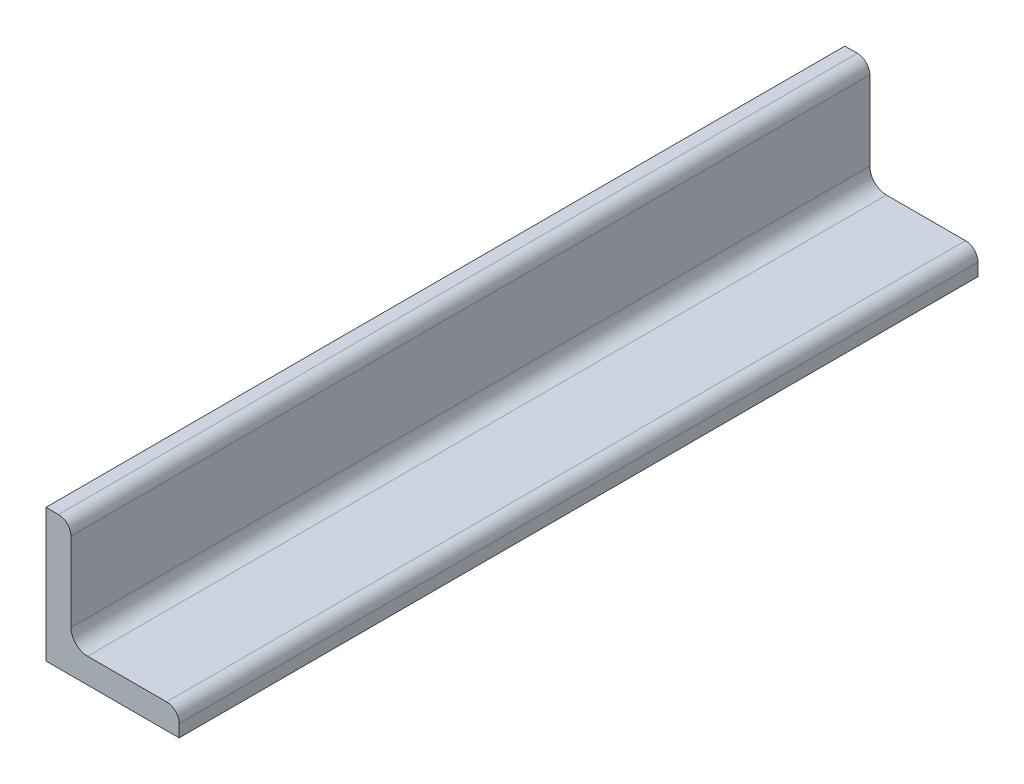
ISO-10303-21;
HEADER;
FILE_DESCRIPTION(('STEP AP214'),'2;1');
FILE_NAME('part.step','',(''),(''),'','','');
FILE_SCHEMA(('AUTOMOTIVE_DESIGN { 1 0 10303 214 1 1 1 1 }'));
ENDSEC;
DATA;
#1=APPLICATION_CONTEXT('core data for automotive mechanical design processes');
#2=APPLICATION_PROTOCOL_DEFINITION('international standard','automotive_design',2000,#1);
#3=PRODUCT_CONTEXT('',#1,'mechanical');
#4=PRODUCT('Part','Part','',(#3));
#5=PRODUCT_RELATED_PRODUCT_CATEGORY('part','',(#4));
#6=PRODUCT_DEFINITION_FORMATION('','',#4);
#7=PRODUCT_DEFINITION_CONTEXT('part definition',#1,'design');
#8=PRODUCT_DEFINITION('design','',#6,#7);
#9=PRODUCT_DEFINITION_SHAPE('','',#8);
#10=(LENGTH_UNIT() NAMED_UNIT(*) SI_UNIT(.MILLI.,.METRE.));
#11=(NAMED_UNIT(*) PLANE_ANGLE_UNIT() SI_UNIT($,.RADIAN.));
#12=(NAMED_UNIT(*) SI_UNIT($,.STERADIAN.) SOLID_ANGLE_UNIT());
#13=UNCERTAINTY_MEASURE_WITH_UNIT(LENGTH_MEASURE(1.E-05),#10,'distance_accuracy_value','');
#14=(GEOMETRIC_REPRESENTATION_CONTEXT(3) GLOBAL_UNCERTAINTY_ASSIGNED_CONTEXT((#13)) GLOBAL_UNIT_ASSIGNED_CONTEXT((#10,
#11,#12)) REPRESENTATION_CONTEXT('',''));
#15=CARTESIAN_POINT('',(0.,0.,0.));
#16=DIRECTION('',(0.,0.,1.));
#17=DIRECTION('',(1.,0.,0.));
#18=AXIS2_PLACEMENT_3D('',#15,#16,#17);
#19=CARTESIAN_POINT('',(0.116507760447575,51.418609434565,304.8));
#20=DIRECTION('',(1.,0.,0.));
#21=DIRECTION('',(0.,0.,-1.));
#22=AXIS2_PLACEMENT_3D('',#19,#20,#21);
#23=PLANE('',#22);
#24=DIRECTION('',(0.,-1.,0.));
#25=VECTOR('',#24,1.);
#26=CARTESIAN_POINT('',(0.116507760447575,51.418609434565,0.));
#27=LINE('',#26,#25);
#28=CARTESIAN_POINT('',(0.116507760447575,51.418609434565,0.));
#29=VERTEX_POINT('',#28);
#30=CARTESIAN_POINT('',(0.116507760447575,0.618609434565042,0.));
#31=VERTEX_POINT('',#30);
#32=EDGE_CURVE('E135',#29,#31,#27,.T.);
#33=ORIENTED_EDGE('',*,*,#32,.T.);
#34=DIRECTION('',(0.,0.,-1.));
#35=VECTOR('',#34,1.);
#36=CARTESIAN_POINT('',(0.116507760447575,0.618609434565042,304.8));
#37=LINE('',#36,#35);
#38=CARTESIAN_POINT('',(0.116507760447575,0.618609434565042,304.8));
#39=VERTEX_POINT('',#38);
#40=EDGE_CURVE('E11',#39,#31,#37,.T.);
#41=ORIENTED_EDGE('',*,*,#40,.F.);
#42=DIRECTION('',(0.,-1.,0.));
#43=VECTOR('',#42,1.);
#44=CARTESIAN_POINT('',(0.116507760447575,51.418609434565,304.8));
#45=LINE('',#44,#43);
#46=CARTESIAN_POINT('',(0.116507760447575,51.418609434565,304.8));
#47=VERTEX_POINT('',#46);
#48=EDGE_CURVE('E151',#47,#39,#45,.T.);
#49=ORIENTED_EDGE('',*,*,#48,.F.);
#50=DIRECTION('',(0.,0.,-1.));
#51=VECTOR('',#50,1.);
#52=CARTESIAN_POINT('',(0.116507760447575,51.418609434565,304.8));
#53=LINE('',#52,#51);
#54=EDGE_CURVE('E131',#47,#29,#53,.T.);
#55=ORIENTED_EDGE('',*,*,#54,.T.);
#56=EDGE_LOOP('',(#33,#41,#49,#55));
#57=FACE_BOUND('',#56,.T.);
#58=ADVANCED_FACE('F33',(#57),#23,.F.);
#59=CARTESIAN_POINT('',(0.116507760447575,0.618609434565042,304.8));
#60=DIRECTION('',(0.,1.,0.));
#61=DIRECTION('',(0.,0.,1.));
#62=AXIS2_PLACEMENT_3D('',#59,#60,#61);
#63=PLANE('',#62);
#64=DIRECTION('',(1.,0.,0.));
#65=VECTOR('',#64,1.);
#66=CARTESIAN_POINT('',(0.116507760447575,0.618609434565042,0.));
#67=LINE('',#66,#65);
#68=CARTESIAN_POINT('',(50.9165077604476,0.618609434565042,0.));
#69=VERTEX_POINT('',#68);
#70=EDGE_CURVE('E138',#31,#69,#67,.T.);
#71=ORIENTED_EDGE('',*,*,#70,.T.);
#72=DIRECTION('',(0.,0.,-1.));
#73=VECTOR('',#72,1.);
#74=CARTESIAN_POINT('',(50.9165077604476,0.618609434565042,304.8));
#75=LINE('',#74,#73);
#76=CARTESIAN_POINT('',(50.9165077604476,0.618609434565042,304.8));
#77=VERTEX_POINT('',#76);
#78=EDGE_CURVE('E41',#77,#69,#75,.T.);
#79=ORIENTED_EDGE('',*,*,#78,.F.);
#80=DIRECTION('',(1.,0.,0.));
#81=VECTOR('',#80,1.);
#82=CARTESIAN_POINT('',(0.116507760447575,0.618609434565042,304.8));
#83=LINE('',#82,#81);
#84=EDGE_CURVE('E95',#39,#77,#83,.T.);
#85=ORIENTED_EDGE('',*,*,#84,.F.);
#86=ORIENTED_EDGE('',*,*,#40,.T.);
#87=EDGE_LOOP('',(#71,#79,#85,#86));
#88=FACE_BOUND('',#87,.T.);
#89=ADVANCED_FACE('F194',(#88),#63,.F.);
#90=CARTESIAN_POINT('',(50.9165077604476,0.618609434565042,304.8));
#91=DIRECTION('',(-1.,0.,0.));
#92=DIRECTION('',(0.,0.,1.));
#93=AXIS2_PLACEMENT_3D('',#90,#91,#92);
#94=PLANE('',#93);
#95=DIRECTION('',(0.,1.,0.));
#96=VECTOR('',#95,1.);
#97=CARTESIAN_POINT('',(50.9165077604476,0.618609434565042,0.));
#98=LINE('',#97,#96);
#99=CARTESIAN_POINT('',(50.9165077604476,5.38110943456504,0.));
#100=VERTEX_POINT('',#99);
#101=EDGE_CURVE('E140',#69,#100,#98,.T.);
#102=ORIENTED_EDGE('',*,*,#101,.T.);
#103=DIRECTION('',(0.,0.,-1.));
#104=VECTOR('',#103,1.);
#105=CARTESIAN_POINT('',(50.9165077604476,5.38110943456504,304.8));
#106=LINE('',#105,#104);
#107=CARTESIAN_POINT('',(50.9165077604476,5.38110943456504,304.8));
#108=VERTEX_POINT('',#107);
#109=EDGE_CURVE('E161',#108,#100,#106,.T.);
#110=ORIENTED_EDGE('',*,*,#109,.F.);
#111=DIRECTION('',(0.,1.,0.));
#112=VECTOR('',#111,1.);
#113=CARTESIAN_POINT('',(50.9165077604476,0.618609434565042,304.8));
#114=LINE('',#113,#112);
#115=EDGE_CURVE('E169',#77,#108,#114,.T.);
#116=ORIENTED_EDGE('',*,*,#115,.F.);
#117=ORIENTED_EDGE('',*,*,#78,.T.);
#118=EDGE_LOOP('',(#102,#110,#116,#117));
#119=FACE_BOUND('',#118,.T.);
#120=ADVANCED_FACE('F167',(#119),#94,.F.);
#121=CARTESIAN_POINT('',(46.1540077604476,5.38110943456504,304.8));
#122=DIRECTION('',(0.,0.,-1.));
#123=DIRECTION('',(-1.,0.,0.));
#124=AXIS2_PLACEMENT_3D('',#121,#122,#123);
#125=CYLINDRICAL_SURFACE('',#124,4.7625);
#126=CARTESIAN_POINT('',(46.1540077604476,5.38110943456504,0.));
#127=DIRECTION('',(0.,0.,1.));
#128=DIRECTION('',(1.,0.,0.));
#129=AXIS2_PLACEMENT_3D('',#126,#127,#128);
#130=CIRCLE('',#129,4.7625);
#131=CARTESIAN_POINT('',(46.1540077604476,10.143609434565,0.));
#132=VERTEX_POINT('',#131);
#133=EDGE_CURVE('E142',#100,#132,#130,.T.);
#134=ORIENTED_EDGE('',*,*,#133,.T.);
#135=DIRECTION('',(0.,0.,-1.));
#136=VECTOR('',#135,1.);
#137=CARTESIAN_POINT('',(46.1540077604476,10.143609434565,304.8));
#138=LINE('',#137,#136);
#139=CARTESIAN_POINT('',(46.1540077604476,10.143609434565,304.8));
#140=VERTEX_POINT('',#139);
#141=EDGE_CURVE('E158',#140,#132,#138,.T.);
#142=ORIENTED_EDGE('',*,*,#141,.F.);
#143=CARTESIAN_POINT('',(46.1540077604476,5.38110943456504,304.8));
#144=DIRECTION('',(0.,0.,1.));
#145=DIRECTION('',(1.,0.,0.));
#146=AXIS2_PLACEMENT_3D('',#143,#144,#145);
#147=CIRCLE('',#146,4.7625);
#148=EDGE_CURVE('E185',#108,#140,#147,.T.);
#149=ORIENTED_EDGE('',*,*,#148,.F.);
#150=ORIENTED_EDGE('',*,*,#109,.T.);
#151=EDGE_LOOP('',(#134,#142,#149,#150));
#152=FACE_BOUND('',#151,.T.);
#153=ADVANCED_FACE('F178',(#152),#125,.T.);
#154=CARTESIAN_POINT('',(46.1540077604476,10.143609434565,304.8));
#155=DIRECTION('',(0.,-1.,0.));
#156=DIRECTION('',(0.,0.,-1.));
#157=AXIS2_PLACEMENT_3D('',#154,#155,#156);
#158=PLANE('',#157);
#159=DIRECTION('',(-1.,0.,0.));
#160=VECTOR('',#159,1.);
#161=CARTESIAN_POINT('',(46.1540077604476,10.143609434565,0.));
#162=LINE('',#161,#160);
#163=CARTESIAN_POINT('',(15.9915077604476,10.143609434565,0.));
#164=VERTEX_POINT('',#163);
#165=EDGE_CURVE('E144',#132,#164,#162,.T.);
#166=ORIENTED_EDGE('',*,*,#165,.T.);
#167=DIRECTION('',(0.,0.,-1.));
#168=VECTOR('',#167,1.);
#169=CARTESIAN_POINT('',(15.9915077604476,10.143609434565,304.8));
#170=LINE('',#169,#168);
#171=CARTESIAN_POINT('',(15.9915077604476,10.143609434565,304.8));
#172=VERTEX_POINT('',#171);
#173=EDGE_CURVE('E155',#172,#164,#170,.T.);
#174=ORIENTED_EDGE('',*,*,#173,.F.);
#175=DIRECTION('',(-1.,0.,0.));
#176=VECTOR('',#175,1.);
#177=CARTESIAN_POINT('',(46.1540077604476,10.143609434565,304.8));
#178=LINE('',#177,#176);
#179=EDGE_CURVE('E184',#140,#172,#178,.T.);
#180=ORIENTED_EDGE('',*,*,#179,.F.);
#181=ORIENTED_EDGE('',*,*,#141,.T.);
#182=EDGE_LOOP('',(#166,#174,#180,#181));
#183=FACE_BOUND('',#182,.T.);
#184=ADVANCED_FACE('F182',(#183),#158,.F.);
#185=CARTESIAN_POINT('',(15.9915077604476,16.493609434565,304.8));
#186=DIRECTION('',(0.,0.,-1.));
#187=DIRECTION('',(-1.,0.,0.));
#188=AXIS2_PLACEMENT_3D('',#185,#186,#187);
#189=CYLINDRICAL_SURFACE('',#188,6.34999999999999);
#190=CARTESIAN_POINT('',(15.9915077604476,16.493609434565,0.));
#191=DIRECTION('',(0.,0.,-1.));
#192=DIRECTION('',(1.,0.,0.));
#193=AXIS2_PLACEMENT_3D('',#190,#191,#192);
#194=CIRCLE('',#193,6.34999999999999);
#195=CARTESIAN_POINT('',(9.64150776044758,16.493609434565,0.));
#196=VERTEX_POINT('',#195);
#197=EDGE_CURVE('E146',#164,#196,#194,.T.);
#198=ORIENTED_EDGE('',*,*,#197,.T.);
#199=DIRECTION('',(0.,0.,-1.));
#200=VECTOR('',#199,1.);
#201=CARTESIAN_POINT('',(9.64150776044758,16.493609434565,304.8));
#202=LINE('',#201,#200);
#203=CARTESIAN_POINT('',(9.64150776044758,16.493609434565,304.8));
#204=VERTEX_POINT('',#203);
#205=EDGE_CURVE('E126',#204,#196,#202,.T.);
#206=ORIENTED_EDGE('',*,*,#205,.F.);
#207=CARTESIAN_POINT('',(15.9915077604476,16.493609434565,304.8));
#208=DIRECTION('',(0.,0.,-1.));
#209=DIRECTION('',(1.,0.,0.));
#210=AXIS2_PLACEMENT_3D('',#207,#208,#209);
#211=CIRCLE('',#210,6.34999999999999);
#212=EDGE_CURVE('E117',#172,#204,#211,.T.);
#213=ORIENTED_EDGE('',*,*,#212,.F.);
#214=ORIENTED_EDGE('',*,*,#173,.T.);
#215=EDGE_LOOP('',(#198,#206,#213,#214));
#216=FACE_BOUND('',#215,.T.);
#217=ADVANCED_FACE('F206',(#216),#189,.F.);
#218=CARTESIAN_POINT('',(9.64150776044758,16.493609434565,304.8));
#219=DIRECTION('',(-1.,0.,0.));
#220=DIRECTION('',(0.,0.,1.));
#221=AXIS2_PLACEMENT_3D('',#218,#219,#220);
#222=PLANE('',#221);
#223=DIRECTION('',(0.,1.,0.));
#224=VECTOR('',#223,1.);
#225=CARTESIAN_POINT('',(9.64150776044758,16.493609434565,0.));
#226=LINE('',#225,#224);
#227=CARTESIAN_POINT('',(9.64150776044758,46.656109434565,0.));
#228=VERTEX_POINT('',#227);
#229=EDGE_CURVE('E125',#196,#228,#226,.T.);
#230=ORIENTED_EDGE('',*,*,#229,.T.);
#231=DIRECTION('',(0.,0.,-1.));
#232=VECTOR('',#231,1.);
#233=CARTESIAN_POINT('',(9.64150776044758,46.656109434565,304.8));
#234=LINE('',#233,#232);
#235=CARTESIAN_POINT('',(9.64150776044758,46.656109434565,304.8));
#236=VERTEX_POINT('',#235);
#237=EDGE_CURVE('E122',#236,#228,#234,.T.);
#238=ORIENTED_EDGE('',*,*,#237,.F.);
#239=DIRECTION('',(0.,1.,0.));
#240=VECTOR('',#239,1.);
#241=CARTESIAN_POINT('',(9.64150776044758,16.493609434565,304.8));
#242=LINE('',#241,#240);
#243=EDGE_CURVE('E111',#204,#236,#242,.T.);
#244=ORIENTED_EDGE('',*,*,#243,.F.);
#245=ORIENTED_EDGE('',*,*,#205,.T.);
#246=EDGE_LOOP('',(#230,#238,#244,#245));
#247=FACE_BOUND('',#246,.T.);
#248=ADVANCED_FACE('F123',(#247),#222,.F.);
#249=CARTESIAN_POINT('',(4.87900776044757,46.656109434565,304.8));
#250=DIRECTION('',(0.,0.,-1.));
#251=DIRECTION('',(-1.,0.,0.));
#252=AXIS2_PLACEMENT_3D('',#249,#250,#251);
#253=CYLINDRICAL_SURFACE('',#252,4.7625);
#254=CARTESIAN_POINT('',(4.87900776044757,46.656109434565,0.));
#255=DIRECTION('',(0.,0.,1.));
#256=DIRECTION('',(1.,0.,0.));
#257=AXIS2_PLACEMENT_3D('',#254,#255,#256);
#258=CIRCLE('',#257,4.7625);
#259=CARTESIAN_POINT('',(4.87900776044758,51.418609434565,0.));
#260=VERTEX_POINT('',#259);
#261=EDGE_CURVE('E81',#228,#260,#258,.T.);
#262=ORIENTED_EDGE('',*,*,#261,.T.);
#263=DIRECTION('',(0.,0.,-1.));
#264=VECTOR('',#263,1.);
#265=CARTESIAN_POINT('',(4.87900776044758,51.418609434565,304.8));
#266=LINE('',#265,#264);
#267=CARTESIAN_POINT('',(4.87900776044758,51.418609434565,304.8));
#268=VERTEX_POINT('',#267);
#269=EDGE_CURVE('E127',#268,#260,#266,.T.);
#270=ORIENTED_EDGE('',*,*,#269,.F.);
#271=CARTESIAN_POINT('',(4.87900776044757,46.656109434565,304.8));
#272=DIRECTION('',(0.,0.,1.));
#273=DIRECTION('',(1.,0.,0.));
#274=AXIS2_PLACEMENT_3D('',#271,#272,#273);
#275=CIRCLE('',#274,4.7625);
#276=EDGE_CURVE('E115',#236,#268,#275,.T.);
#277=ORIENTED_EDGE('',*,*,#276,.F.);
#278=ORIENTED_EDGE('',*,*,#237,.T.);
#279=EDGE_LOOP('',(#262,#270,#277,#278));
#280=FACE_BOUND('',#279,.T.);
#281=ADVANCED_FACE('F129',(#280),#253,.T.);
#282=CARTESIAN_POINT('',(4.87900776044758,51.418609434565,304.8));
#283=DIRECTION('',(0.,-1.,0.));
#284=DIRECTION('',(0.,0.,-1.));
#285=AXIS2_PLACEMENT_3D('',#282,#283,#284);
#286=PLANE('',#285);
#287=DIRECTION('',(-1.,0.,0.));
#288=VECTOR('',#287,1.);
#289=CARTESIAN_POINT('',(4.87900776044758,51.418609434565,0.));
#290=LINE('',#289,#288);
#291=EDGE_CURVE('E87',#260,#29,#290,.T.);
#292=ORIENTED_EDGE('',*,*,#291,.T.);
#293=ORIENTED_EDGE('',*,*,#54,.F.);
#294=DIRECTION('',(-1.,0.,0.));
#295=VECTOR('',#294,1.);
#296=CARTESIAN_POINT('',(4.87900776044758,51.418609434565,304.8));
#297=LINE('',#296,#295);
#298=EDGE_CURVE('E49',#268,#47,#297,.T.);
#299=ORIENTED_EDGE('',*,*,#298,.F.);
#300=ORIENTED_EDGE('',*,*,#269,.T.);
#301=EDGE_LOOP('',(#292,#293,#299,#300));
#302=FACE_BOUND('',#301,.T.);
#303=ADVANCED_FACE('F214',(#302),#286,.F.);
#304=CARTESIAN_POINT('',(46.1540077604476,5.38110943456504,304.8));
#305=DIRECTION('',(0.,0.,1.));
#306=DIRECTION('',(1.,0.,0.));
#307=AXIS2_PLACEMENT_3D('',#304,#305,#306);
#308=PLANE('',#307);
#309=ORIENTED_EDGE('',*,*,#48,.T.);
#310=ORIENTED_EDGE('',*,*,#84,.T.);
#311=ORIENTED_EDGE('',*,*,#115,.T.);
#312=ORIENTED_EDGE('',*,*,#148,.T.);
#313=ORIENTED_EDGE('',*,*,#179,.T.);
#314=ORIENTED_EDGE('',*,*,#212,.T.);
#315=ORIENTED_EDGE('',*,*,#243,.T.);
#316=ORIENTED_EDGE('',*,*,#276,.T.);
#317=ORIENTED_EDGE('',*,*,#298,.T.);
#318=EDGE_LOOP('',(#309,#310,#311,#312,#313,#314,#315,#316,#317));
#319=FACE_BOUND('',#318,.T.);
#320=ADVANCED_FACE('F113',(#319),#308,.T.);
#321=CARTESIAN_POINT('',(46.1540077604476,5.38110943456504,0.));
#322=DIRECTION('',(0.,0.,1.));
#323=DIRECTION('',(1.,0.,0.));
#324=AXIS2_PLACEMENT_3D('',#321,#322,#323);
#325=PLANE('',#324);
#326=ORIENTED_EDGE('',*,*,#32,.F.);
#327=ORIENTED_EDGE('',*,*,#291,.F.);
#328=ORIENTED_EDGE('',*,*,#261,.F.);
#329=ORIENTED_EDGE('',*,*,#229,.F.);
#330=ORIENTED_EDGE('',*,*,#197,.F.);
#331=ORIENTED_EDGE('',*,*,#165,.F.);
#332=ORIENTED_EDGE('',*,*,#133,.F.);
#333=ORIENTED_EDGE('',*,*,#101,.F.);
#334=ORIENTED_EDGE('',*,*,#70,.F.);
#335=EDGE_LOOP('',(#326,#327,#328,#329,#330,#331,#332,#333,#334));
#336=FACE_BOUND('',#335,.T.);
#337=ADVANCED_FACE('F173',(#336),#325,.F.);
#338=CLOSED_SHELL('',(#58,#89,#120,#153,#184,#217,#248,#281,#303,#320,#337));
#339=MANIFOLD_SOLID_BREP('B2',#338);
#340=ADVANCED_BREP_SHAPE_REPRESENTATION('',(#18,#339),#14);
#341=SHAPE_DEFINITION_REPRESENTATION(#9,#340);
ENDSEC;
END-ISO-10303-21;
